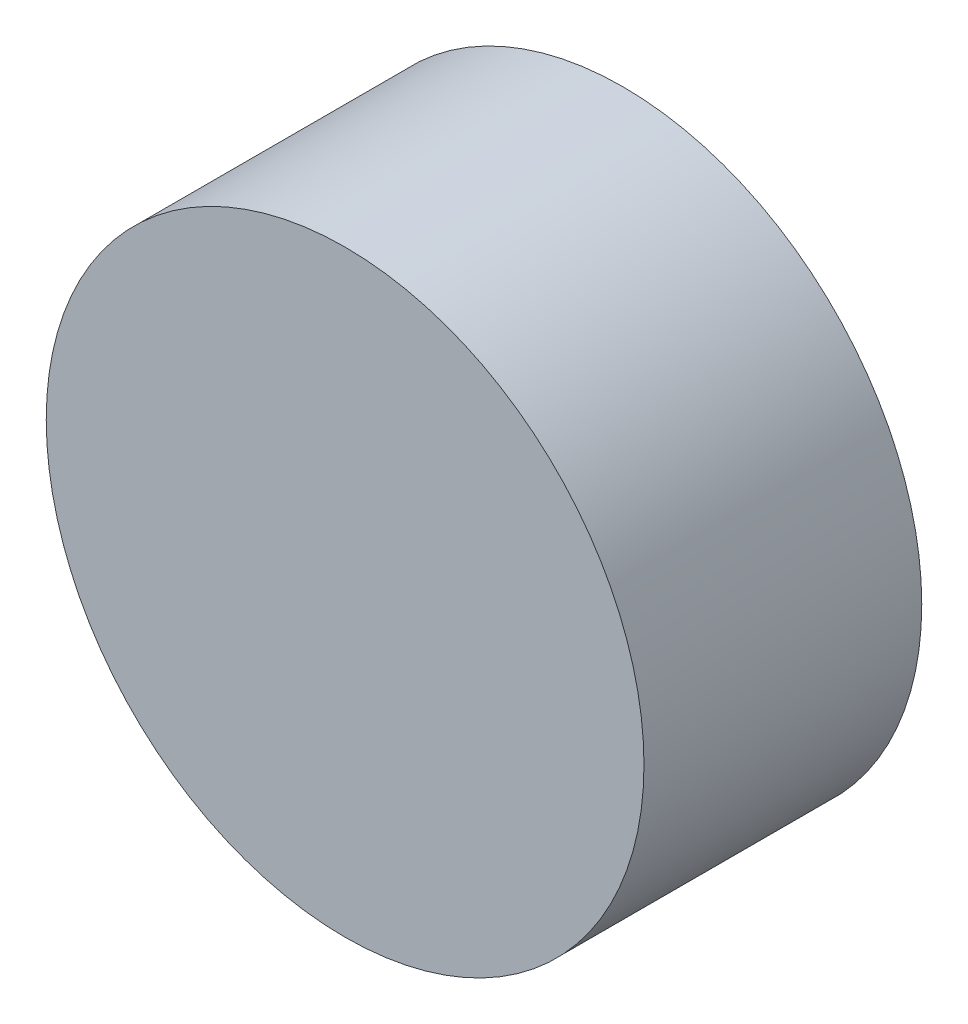
ISO-10303-21;
HEADER;
FILE_DESCRIPTION(('STEP AP214'),'2;1');
FILE_NAME('part.step','',(''),(''),'','','');
FILE_SCHEMA(('AUTOMOTIVE_DESIGN { 1 0 10303 214 1 1 1 1 }'));
ENDSEC;
DATA;
#1=APPLICATION_CONTEXT('core data for automotive mechanical design processes');
#2=APPLICATION_PROTOCOL_DEFINITION('international standard','automotive_design',2000,#1);
#3=PRODUCT_CONTEXT('',#1,'mechanical');
#4=PRODUCT('Part','Part','',(#3));
#5=PRODUCT_RELATED_PRODUCT_CATEGORY('part','',(#4));
#6=PRODUCT_DEFINITION_FORMATION('','',#4);
#7=PRODUCT_DEFINITION_CONTEXT('part definition',#1,'design');
#8=PRODUCT_DEFINITION('design','',#6,#7);
#9=PRODUCT_DEFINITION_SHAPE('','',#8);
#10=(LENGTH_UNIT() NAMED_UNIT(*) SI_UNIT(.MILLI.,.METRE.));
#11=(NAMED_UNIT(*) PLANE_ANGLE_UNIT() SI_UNIT($,.RADIAN.));
#12=(NAMED_UNIT(*) SI_UNIT($,.STERADIAN.) SOLID_ANGLE_UNIT());
#13=UNCERTAINTY_MEASURE_WITH_UNIT(LENGTH_MEASURE(1.E-05),#10,'distance_accuracy_value','');
#14=(GEOMETRIC_REPRESENTATION_CONTEXT(3) GLOBAL_UNCERTAINTY_ASSIGNED_CONTEXT((#13)) GLOBAL_UNIT_ASSIGNED_CONTEXT((#10,
#11,#12)) REPRESENTATION_CONTEXT('',''));
#15=CARTESIAN_POINT('',(0.,0.,0.));
#16=DIRECTION('',(0.,0.,1.));
#17=DIRECTION('',(1.,0.,0.));
#18=AXIS2_PLACEMENT_3D('',#15,#16,#17);
#19=CARTESIAN_POINT('',(0.,0.,40.132));
#20=DIRECTION('',(0.,0.,-1.));
#21=DIRECTION('',(-1.,0.,0.));
#22=AXIS2_PLACEMENT_3D('',#19,#20,#21);
#23=CYLINDRICAL_SURFACE('',#22,43.18);
#24=CARTESIAN_POINT('',(0.,0.,40.132));
#25=DIRECTION('',(0.,0.,1.));
#26=DIRECTION('',(1.,0.,0.));
#27=AXIS2_PLACEMENT_3D('',#24,#25,#26);
#28=CIRCLE('',#27,43.18);
#29=CARTESIAN_POINT('',(43.18,0.,40.132));
#30=VERTEX_POINT('',#29);
#31=EDGE_CURVE('E10',#30,#30,#28,.T.);
#32=ORIENTED_EDGE('',*,*,#31,.F.);
#33=EDGE_LOOP('',(#32));
#34=FACE_BOUND('',#33,.T.);
#35=CARTESIAN_POINT('',(0.,0.,0.));
#36=DIRECTION('',(0.,0.,1.));
#37=DIRECTION('',(1.,0.,0.));
#38=AXIS2_PLACEMENT_3D('',#35,#36,#37);
#39=CIRCLE('',#38,43.18);
#40=CARTESIAN_POINT('',(43.18,0.,0.));
#41=VERTEX_POINT('',#40);
#42=EDGE_CURVE('E38',#41,#41,#39,.T.);
#43=ORIENTED_EDGE('',*,*,#42,.T.);
#44=EDGE_LOOP('',(#43));
#45=FACE_BOUND('',#44,.T.);
#46=ADVANCED_FACE('F35',(#34,#45),#23,.T.);
#47=CARTESIAN_POINT('',(0.,0.,40.132));
#48=DIRECTION('',(0.,0.,1.));
#49=DIRECTION('',(1.,0.,0.));
#50=AXIS2_PLACEMENT_3D('',#47,#48,#49);
#51=PLANE('',#50);
#52=ORIENTED_EDGE('',*,*,#31,.T.);
#53=EDGE_LOOP('',(#52));
#54=FACE_BOUND('',#53,.T.);
#55=ADVANCED_FACE('F50',(#54),#51,.T.);
#56=CARTESIAN_POINT('',(0.,0.,0.));
#57=DIRECTION('',(0.,0.,1.));
#58=DIRECTION('',(1.,0.,0.));
#59=AXIS2_PLACEMENT_3D('',#56,#57,#58);
#60=PLANE('',#59);
#61=ORIENTED_EDGE('',*,*,#42,.F.);
#62=EDGE_LOOP('',(#61));
#63=FACE_BOUND('',#62,.T.);
#64=ADVANCED_FACE('F48',(#63),#60,.F.);
#65=CLOSED_SHELL('',(#46,#55,#64));
#66=MANIFOLD_SOLID_BREP('B2',#65);
#67=ADVANCED_BREP_SHAPE_REPRESENTATION('',(#18,#66),#14);
#68=SHAPE_DEFINITION_REPRESENTATION(#9,#67);
ENDSEC;
END-ISO-10303-21;
